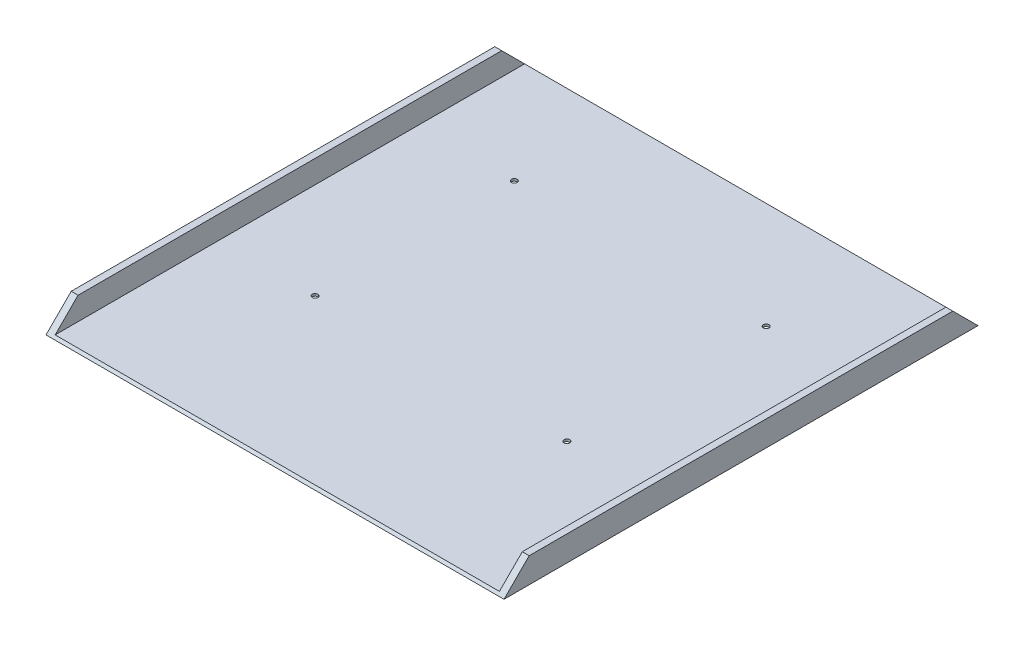
ISO-10303-21;
HEADER;
FILE_DESCRIPTION(('STEP AP214'),'2;1');
FILE_NAME('part.step','',(''),(''),'','','');
FILE_SCHEMA(('AUTOMOTIVE_DESIGN { 1 0 10303 214 1 1 1 1 }'));
ENDSEC;
DATA;
#1=APPLICATION_CONTEXT('core data for automotive mechanical design processes');
#2=APPLICATION_PROTOCOL_DEFINITION('international standard','automotive_design',2000,#1);
#3=PRODUCT_CONTEXT('',#1,'mechanical');
#4=PRODUCT('Part','Part','',(#3));
#5=PRODUCT_RELATED_PRODUCT_CATEGORY('part','',(#4));
#6=PRODUCT_DEFINITION_FORMATION('','',#4);
#7=PRODUCT_DEFINITION_CONTEXT('part definition',#1,'design');
#8=PRODUCT_DEFINITION('design','',#6,#7);
#9=PRODUCT_DEFINITION_SHAPE('','',#8);
#10=(LENGTH_UNIT() NAMED_UNIT(*) SI_UNIT(.MILLI.,.METRE.));
#11=(NAMED_UNIT(*) PLANE_ANGLE_UNIT() SI_UNIT($,.RADIAN.));
#12=(NAMED_UNIT(*) SI_UNIT($,.STERADIAN.) SOLID_ANGLE_UNIT());
#13=UNCERTAINTY_MEASURE_WITH_UNIT(LENGTH_MEASURE(1.E-05),#10,'distance_accuracy_value','');
#14=(GEOMETRIC_REPRESENTATION_CONTEXT(3) GLOBAL_UNCERTAINTY_ASSIGNED_CONTEXT((#13)) GLOBAL_UNIT_ASSIGNED_CONTEXT((#10,
#11,#12)) REPRESENTATION_CONTEXT('',''));
#15=CARTESIAN_POINT('',(0.,0.,0.));
#16=DIRECTION('',(0.,0.,1.));
#17=DIRECTION('',(1.,0.,0.));
#18=AXIS2_PLACEMENT_3D('',#15,#16,#17);
#19=CARTESIAN_POINT('',(0.,1.,0.));
#20=DIRECTION('',(0.,1.,0.));
#21=DIRECTION('',(0.,0.,1.));
#22=AXIS2_PLACEMENT_3D('',#19,#20,#21);
#23=PLANE('',#22);
#24=DIRECTION('',(0.,0.,-1.));
#25=VECTOR('',#24,1.);
#26=CARTESIAN_POINT('',(3.,1.,0.));
#27=LINE('',#26,#25);
#28=CARTESIAN_POINT('',(3.00000000000003,1.,215.));
#29=VERTEX_POINT('',#28);
#30=CARTESIAN_POINT('',(3.,1.,10.0000000000002));
#31=VERTEX_POINT('',#30);
#32=EDGE_CURVE('E141',#29,#31,#27,.T.);
#33=ORIENTED_EDGE('',*,*,#32,.F.);
#34=DIRECTION('',(1.,0.,0.));
#35=VECTOR('',#34,1.);
#36=CARTESIAN_POINT('',(0.,1.,215.));
#37=LINE('',#36,#35);
#38=CARTESIAN_POINT('',(197.,1.,215.));
#39=VERTEX_POINT('',#38);
#40=EDGE_CURVE('E221',#29,#39,#37,.T.);
#41=ORIENTED_EDGE('',*,*,#40,.T.);
#42=DIRECTION('',(0.,0.,1.));
#43=VECTOR('',#42,1.);
#44=CARTESIAN_POINT('',(197.,1.,0.));
#45=LINE('',#44,#43);
#46=CARTESIAN_POINT('',(197.,1.,10.0000000000002));
#47=VERTEX_POINT('',#46);
#48=EDGE_CURVE('E147',#47,#39,#45,.T.);
#49=ORIENTED_EDGE('',*,*,#48,.F.);
#50=DIRECTION('',(-1.,0.,0.));
#51=VECTOR('',#50,1.);
#52=CARTESIAN_POINT('',(0.,1.,10.0000000000002));
#53=LINE('',#52,#51);
#54=EDGE_CURVE('E208',#47,#31,#53,.T.);
#55=ORIENTED_EDGE('',*,*,#54,.T.);
#56=EDGE_LOOP('',(#33,#41,#49,#55));
#57=FACE_BOUND('',#56,.T.);
#58=CARTESIAN_POINT('',(45.,1.,143.5));
#59=DIRECTION('',(0.,1.,0.));
#60=DIRECTION('',(0.,0.,1.));
#61=AXIS2_PLACEMENT_3D('',#58,#59,#60);
#62=CIRCLE('',#61,1.25);
#63=CARTESIAN_POINT('',(45.,1.,144.75));
#64=VERTEX_POINT('',#63);
#65=EDGE_CURVE('E168',#64,#64,#62,.T.);
#66=ORIENTED_EDGE('',*,*,#65,.F.);
#67=EDGE_LOOP('',(#66));
#68=FACE_BOUND('',#67,.T.);
#69=CARTESIAN_POINT('',(45.,1.,56.5));
#70=DIRECTION('',(0.,1.,0.));
#71=DIRECTION('',(0.,0.,1.));
#72=AXIS2_PLACEMENT_3D('',#69,#70,#71);
#73=CIRCLE('',#72,1.25);
#74=CARTESIAN_POINT('',(45.,1.,57.75));
#75=VERTEX_POINT('',#74);
#76=EDGE_CURVE('E184',#75,#75,#73,.T.);
#77=ORIENTED_EDGE('',*,*,#76,.F.);
#78=EDGE_LOOP('',(#77));
#79=FACE_BOUND('',#78,.T.);
#80=CARTESIAN_POINT('',(155.,1.,56.5));
#81=DIRECTION('',(0.,1.,0.));
#82=DIRECTION('',(0.,0.,-1.));
#83=AXIS2_PLACEMENT_3D('',#80,#81,#82);
#84=CIRCLE('',#83,1.25000000000001);
#85=CARTESIAN_POINT('',(155.,1.,55.25));
#86=VERTEX_POINT('',#85);
#87=EDGE_CURVE('E176',#86,#86,#84,.T.);
#88=ORIENTED_EDGE('',*,*,#87,.F.);
#89=EDGE_LOOP('',(#88));
#90=FACE_BOUND('',#89,.T.);
#91=CARTESIAN_POINT('',(155.,1.,143.5));
#92=DIRECTION('',(0.,1.,0.));
#93=DIRECTION('',(0.,0.,-1.));
#94=AXIS2_PLACEMENT_3D('',#91,#92,#93);
#95=CIRCLE('',#94,1.25000000000001);
#96=CARTESIAN_POINT('',(155.,1.,142.25));
#97=VERTEX_POINT('',#96);
#98=EDGE_CURVE('E160',#97,#97,#95,.T.);
#99=ORIENTED_EDGE('',*,*,#98,.F.);
#100=EDGE_LOOP('',(#99));
#101=FACE_BOUND('',#100,.T.);
#102=ADVANCED_FACE('F47',(#57,#68,#79,#90,#101),#23,.T.);
#103=CARTESIAN_POINT('',(0.,0.,0.));
#104=DIRECTION('',(0.,1.,0.));
#105=DIRECTION('',(0.,0.,1.));
#106=AXIS2_PLACEMENT_3D('',#103,#104,#105);
#107=PLANE('',#106);
#108=DIRECTION('',(0.,0.,-1.));
#109=VECTOR('',#108,1.);
#110=CARTESIAN_POINT('',(200.,0.,0.));
#111=LINE('',#110,#109);
#112=CARTESIAN_POINT('',(200.,0.,216.));
#113=VERTEX_POINT('',#112);
#114=CARTESIAN_POINT('',(200.,0.,9.00000000000024));
#115=VERTEX_POINT('',#114);
#116=EDGE_CURVE('E136',#113,#115,#111,.T.);
#117=ORIENTED_EDGE('',*,*,#116,.F.);
#118=DIRECTION('',(-1.,0.,0.));
#119=VECTOR('',#118,1.);
#120=CARTESIAN_POINT('',(0.,0.,216.));
#121=LINE('',#120,#119);
#122=CARTESIAN_POINT('',(0.,0.,216.));
#123=VERTEX_POINT('',#122);
#124=EDGE_CURVE('E57',#113,#123,#121,.T.);
#125=ORIENTED_EDGE('',*,*,#124,.T.);
#126=DIRECTION('',(0.,0.,1.));
#127=VECTOR('',#126,1.);
#128=CARTESIAN_POINT('',(0.,0.,0.));
#129=LINE('',#128,#127);
#130=CARTESIAN_POINT('',(0.,0.,9.00000000000024));
#131=VERTEX_POINT('',#130);
#132=EDGE_CURVE('E188',#131,#123,#129,.T.);
#133=ORIENTED_EDGE('',*,*,#132,.F.);
#134=DIRECTION('',(1.,0.,0.));
#135=VECTOR('',#134,1.);
#136=CARTESIAN_POINT('',(0.,0.,9.00000000000024));
#137=LINE('',#136,#135);
#138=EDGE_CURVE('E121',#131,#115,#137,.T.);
#139=ORIENTED_EDGE('',*,*,#138,.T.);
#140=EDGE_LOOP('',(#117,#125,#133,#139));
#141=FACE_BOUND('',#140,.T.);
#142=CARTESIAN_POINT('',(45.,0.,56.5));
#143=DIRECTION('',(0.,1.,0.));
#144=DIRECTION('',(0.,0.,1.));
#145=AXIS2_PLACEMENT_3D('',#142,#143,#144);
#146=CIRCLE('',#145,1.25);
#147=CARTESIAN_POINT('',(45.,0.,57.75));
#148=VERTEX_POINT('',#147);
#149=EDGE_CURVE('E180',#148,#148,#146,.T.);
#150=ORIENTED_EDGE('',*,*,#149,.T.);
#151=EDGE_LOOP('',(#150));
#152=FACE_BOUND('',#151,.T.);
#153=CARTESIAN_POINT('',(155.,0.,56.5));
#154=DIRECTION('',(0.,1.,0.));
#155=DIRECTION('',(0.,0.,-1.));
#156=AXIS2_PLACEMENT_3D('',#153,#154,#155);
#157=CIRCLE('',#156,1.25000000000001);
#158=CARTESIAN_POINT('',(155.,0.,55.25));
#159=VERTEX_POINT('',#158);
#160=EDGE_CURVE('E172',#159,#159,#157,.T.);
#161=ORIENTED_EDGE('',*,*,#160,.T.);
#162=EDGE_LOOP('',(#161));
#163=FACE_BOUND('',#162,.T.);
#164=CARTESIAN_POINT('',(45.,0.,143.5));
#165=DIRECTION('',(0.,1.,0.));
#166=DIRECTION('',(0.,0.,1.));
#167=AXIS2_PLACEMENT_3D('',#164,#165,#166);
#168=CIRCLE('',#167,1.25);
#169=CARTESIAN_POINT('',(45.,0.,144.75));
#170=VERTEX_POINT('',#169);
#171=EDGE_CURVE('E164',#170,#170,#168,.T.);
#172=ORIENTED_EDGE('',*,*,#171,.T.);
#173=EDGE_LOOP('',(#172));
#174=FACE_BOUND('',#173,.T.);
#175=CARTESIAN_POINT('',(155.,0.,143.5));
#176=DIRECTION('',(0.,1.,0.));
#177=DIRECTION('',(0.,0.,-1.));
#178=AXIS2_PLACEMENT_3D('',#175,#176,#177);
#179=CIRCLE('',#178,1.25000000000001);
#180=CARTESIAN_POINT('',(155.,0.,142.25));
#181=VERTEX_POINT('',#180);
#182=EDGE_CURVE('E145',#181,#181,#179,.T.);
#183=ORIENTED_EDGE('',*,*,#182,.T.);
#184=EDGE_LOOP('',(#183));
#185=FACE_BOUND('',#184,.T.);
#186=ADVANCED_FACE('F265',(#141,#152,#163,#174,#185),#107,.F.);
#187=CARTESIAN_POINT('',(0.,1.,0.));
#188=DIRECTION('',(1.,0.,0.));
#189=DIRECTION('',(0.,0.,-1.));
#190=AXIS2_PLACEMENT_3D('',#187,#188,#189);
#191=PLANE('',#190);
#192=ORIENTED_EDGE('',*,*,#132,.T.);
#193=DIRECTION('',(0.,0.707106781186544,-0.707106781186551));
#194=VECTOR('',#193,1.);
#195=CARTESIAN_POINT('',(0.,11.,205.));
#196=LINE('',#195,#194);
#197=CARTESIAN_POINT('',(0.,11.,205.));
#198=VERTEX_POINT('',#197);
#199=EDGE_CURVE('E11',#123,#198,#196,.T.);
#200=ORIENTED_EDGE('',*,*,#199,.T.);
#201=DIRECTION('',(0.,0.,1.));
#202=VECTOR('',#201,1.);
#203=CARTESIAN_POINT('',(0.,11.,0.));
#204=LINE('',#203,#202);
#205=CARTESIAN_POINT('',(0.,11.,20.0000000000004));
#206=VERTEX_POINT('',#205);
#207=EDGE_CURVE('E130',#206,#198,#204,.T.);
#208=ORIENTED_EDGE('',*,*,#207,.F.);
#209=DIRECTION('',(0.,-0.707106781186544,-0.707106781186551));
#210=VECTOR('',#209,1.);
#211=CARTESIAN_POINT('',(0.,11.,20.0000000000004));
#212=LINE('',#211,#210);
#213=EDGE_CURVE('E114',#206,#131,#212,.T.);
#214=ORIENTED_EDGE('',*,*,#213,.T.);
#215=EDGE_LOOP('',(#192,#200,#208,#214));
#216=FACE_BOUND('',#215,.T.);
#217=ADVANCED_FACE('F138',(#216),#191,.F.);
#218=CARTESIAN_POINT('',(200.,1.,0.));
#219=DIRECTION('',(-1.,0.,0.));
#220=DIRECTION('',(0.,0.,1.));
#221=AXIS2_PLACEMENT_3D('',#218,#219,#220);
#222=PLANE('',#221);
#223=DIRECTION('',(0.,0.,-1.));
#224=VECTOR('',#223,1.);
#225=CARTESIAN_POINT('',(200.,11.,0.));
#226=LINE('',#225,#224);
#227=CARTESIAN_POINT('',(200.,11.,205.));
#228=VERTEX_POINT('',#227);
#229=CARTESIAN_POINT('',(200.,11.,20.0000000000004));
#230=VERTEX_POINT('',#229);
#231=EDGE_CURVE('E153',#228,#230,#226,.T.);
#232=ORIENTED_EDGE('',*,*,#231,.F.);
#233=DIRECTION('',(0.,-0.707106781186544,0.707106781186551));
#234=VECTOR('',#233,1.);
#235=CARTESIAN_POINT('',(200.,11.,205.));
#236=LINE('',#235,#234);
#237=EDGE_CURVE('E71',#228,#113,#236,.T.);
#238=ORIENTED_EDGE('',*,*,#237,.T.);
#239=ORIENTED_EDGE('',*,*,#116,.T.);
#240=DIRECTION('',(0.,0.707106781186544,0.707106781186551));
#241=VECTOR('',#240,1.);
#242=CARTESIAN_POINT('',(200.,11.,20.0000000000003));
#243=LINE('',#242,#241);
#244=EDGE_CURVE('E198',#115,#230,#243,.T.);
#245=ORIENTED_EDGE('',*,*,#244,.T.);
#246=EDGE_LOOP('',(#232,#238,#239,#245));
#247=FACE_BOUND('',#246,.T.);
#248=ADVANCED_FACE('F238',(#247),#222,.F.);
#249=CARTESIAN_POINT('',(45.,1.,56.5));
#250=DIRECTION('',(0.,-1.,0.));
#251=DIRECTION('',(0.,0.,-1.));
#252=AXIS2_PLACEMENT_3D('',#249,#250,#251);
#253=CYLINDRICAL_SURFACE('',#252,1.25);
#254=ORIENTED_EDGE('',*,*,#76,.T.);
#255=EDGE_LOOP('',(#254));
#256=FACE_BOUND('',#255,.T.);
#257=ORIENTED_EDGE('',*,*,#149,.F.);
#258=EDGE_LOOP('',(#257));
#259=FACE_BOUND('',#258,.T.);
#260=ADVANCED_FACE('F273',(#256,#259),#253,.F.);
#261=CARTESIAN_POINT('',(155.,1.,56.5));
#262=DIRECTION('',(0.,-1.,0.));
#263=DIRECTION('',(0.,0.,-1.));
#264=AXIS2_PLACEMENT_3D('',#261,#262,#263);
#265=CYLINDRICAL_SURFACE('',#264,1.25000000000001);
#266=ORIENTED_EDGE('',*,*,#87,.T.);
#267=EDGE_LOOP('',(#266));
#268=FACE_BOUND('',#267,.T.);
#269=ORIENTED_EDGE('',*,*,#160,.F.);
#270=EDGE_LOOP('',(#269));
#271=FACE_BOUND('',#270,.T.);
#272=ADVANCED_FACE('F334',(#268,#271),#265,.F.);
#273=CARTESIAN_POINT('',(45.,1.,143.5));
#274=DIRECTION('',(0.,-1.,0.));
#275=DIRECTION('',(0.,0.,-1.));
#276=AXIS2_PLACEMENT_3D('',#273,#274,#275);
#277=CYLINDRICAL_SURFACE('',#276,1.25);
#278=ORIENTED_EDGE('',*,*,#65,.T.);
#279=EDGE_LOOP('',(#278));
#280=FACE_BOUND('',#279,.T.);
#281=ORIENTED_EDGE('',*,*,#171,.F.);
#282=EDGE_LOOP('',(#281));
#283=FACE_BOUND('',#282,.T.);
#284=ADVANCED_FACE('F260',(#280,#283),#277,.F.);
#285=CARTESIAN_POINT('',(155.,1.,143.5));
#286=DIRECTION('',(0.,-1.,0.));
#287=DIRECTION('',(0.,0.,-1.));
#288=AXIS2_PLACEMENT_3D('',#285,#286,#287);
#289=CYLINDRICAL_SURFACE('',#288,1.25000000000001);
#290=ORIENTED_EDGE('',*,*,#98,.T.);
#291=EDGE_LOOP('',(#290));
#292=FACE_BOUND('',#291,.T.);
#293=ORIENTED_EDGE('',*,*,#182,.F.);
#294=EDGE_LOOP('',(#293));
#295=FACE_BOUND('',#294,.T.);
#296=ADVANCED_FACE('F252',(#292,#295),#289,.F.);
#297=CARTESIAN_POINT('',(197.,11.,0.));
#298=DIRECTION('',(1.,0.,0.));
#299=DIRECTION('',(0.,0.,-1.));
#300=AXIS2_PLACEMENT_3D('',#297,#298,#299);
#301=PLANE('',#300);
#302=ORIENTED_EDGE('',*,*,#48,.T.);
#303=DIRECTION('',(0.,0.707106781186544,-0.707106781186551));
#304=VECTOR('',#303,1.);
#305=CARTESIAN_POINT('',(197.,11.,205.));
#306=LINE('',#305,#304);
#307=CARTESIAN_POINT('',(197.,11.,205.));
#308=VERTEX_POINT('',#307);
#309=EDGE_CURVE('E224',#39,#308,#306,.T.);
#310=ORIENTED_EDGE('',*,*,#309,.T.);
#311=DIRECTION('',(0.,0.,1.));
#312=VECTOR('',#311,1.);
#313=CARTESIAN_POINT('',(197.,11.,0.));
#314=LINE('',#313,#312);
#315=CARTESIAN_POINT('',(197.,11.,20.0000000000004));
#316=VERTEX_POINT('',#315);
#317=EDGE_CURVE('E154',#316,#308,#314,.T.);
#318=ORIENTED_EDGE('',*,*,#317,.F.);
#319=DIRECTION('',(0.,-0.707106781186544,-0.707106781186551));
#320=VECTOR('',#319,1.);
#321=CARTESIAN_POINT('',(197.,11.,20.0000000000003));
#322=LINE('',#321,#320);
#323=EDGE_CURVE('E205',#316,#47,#322,.T.);
#324=ORIENTED_EDGE('',*,*,#323,.T.);
#325=EDGE_LOOP('',(#302,#310,#318,#324));
#326=FACE_BOUND('',#325,.T.);
#327=ADVANCED_FACE('F250',(#326),#301,.F.);
#328=CARTESIAN_POINT('',(0.,11.,0.));
#329=DIRECTION('',(0.,-1.,0.));
#330=DIRECTION('',(0.,0.,-1.));
#331=AXIS2_PLACEMENT_3D('',#328,#329,#330);
#332=PLANE('',#331);
#333=ORIENTED_EDGE('',*,*,#317,.T.);
#334=DIRECTION('',(1.,0.,0.));
#335=VECTOR('',#334,1.);
#336=CARTESIAN_POINT('',(0.,11.,205.));
#337=LINE('',#336,#335);
#338=EDGE_CURVE('E227',#308,#228,#337,.T.);
#339=ORIENTED_EDGE('',*,*,#338,.T.);
#340=ORIENTED_EDGE('',*,*,#231,.T.);
#341=DIRECTION('',(-1.,0.,0.));
#342=VECTOR('',#341,1.);
#343=CARTESIAN_POINT('',(0.,11.,20.0000000000004));
#344=LINE('',#343,#342);
#345=EDGE_CURVE('E202',#230,#316,#344,.T.);
#346=ORIENTED_EDGE('',*,*,#345,.T.);
#347=EDGE_LOOP('',(#333,#339,#340,#346));
#348=FACE_BOUND('',#347,.T.);
#349=ADVANCED_FACE('F234',(#348),#332,.F.);
#350=CARTESIAN_POINT('',(3.,11.,0.));
#351=DIRECTION('',(-1.,0.,0.));
#352=DIRECTION('',(0.,0.,1.));
#353=AXIS2_PLACEMENT_3D('',#350,#351,#352);
#354=PLANE('',#353);
#355=DIRECTION('',(0.,0.,-1.));
#356=VECTOR('',#355,1.);
#357=CARTESIAN_POINT('',(3.,11.,0.));
#358=LINE('',#357,#356);
#359=CARTESIAN_POINT('',(3.00000000000002,11.,205.));
#360=VERTEX_POINT('',#359);
#361=CARTESIAN_POINT('',(3.,11.,20.0000000000004));
#362=VERTEX_POINT('',#361);
#363=EDGE_CURVE('E133',#360,#362,#358,.T.);
#364=ORIENTED_EDGE('',*,*,#363,.F.);
#365=DIRECTION('',(0.,-0.707106781186544,0.707106781186551));
#366=VECTOR('',#365,1.);
#367=CARTESIAN_POINT('',(3.00000000000002,11.,205.));
#368=LINE('',#367,#366);
#369=EDGE_CURVE('E218',#360,#29,#368,.T.);
#370=ORIENTED_EDGE('',*,*,#369,.T.);
#371=ORIENTED_EDGE('',*,*,#32,.T.);
#372=DIRECTION('',(0.,0.707106781186544,0.707106781186551));
#373=VECTOR('',#372,1.);
#374=CARTESIAN_POINT('',(3.,11.,20.0000000000004));
#375=LINE('',#374,#373);
#376=EDGE_CURVE('E212',#31,#362,#375,.T.);
#377=ORIENTED_EDGE('',*,*,#376,.T.);
#378=EDGE_LOOP('',(#364,#370,#371,#377));
#379=FACE_BOUND('',#378,.T.);
#380=ADVANCED_FACE('F242',(#379),#354,.F.);
#381=CARTESIAN_POINT('',(0.,11.,0.));
#382=DIRECTION('',(0.,1.,0.));
#383=DIRECTION('',(0.,0.,1.));
#384=AXIS2_PLACEMENT_3D('',#381,#382,#383);
#385=PLANE('',#384);
#386=ORIENTED_EDGE('',*,*,#207,.T.);
#387=DIRECTION('',(1.,0.,0.));
#388=VECTOR('',#387,1.);
#389=CARTESIAN_POINT('',(3.00000000000003,11.,205.));
#390=LINE('',#389,#388);
#391=EDGE_CURVE('E215',#198,#360,#390,.T.);
#392=ORIENTED_EDGE('',*,*,#391,.T.);
#393=ORIENTED_EDGE('',*,*,#363,.T.);
#394=DIRECTION('',(-1.,0.,0.));
#395=VECTOR('',#394,1.);
#396=CARTESIAN_POINT('',(0.,11.,20.0000000000004));
#397=LINE('',#396,#395);
#398=EDGE_CURVE('E119',#362,#206,#397,.T.);
#399=ORIENTED_EDGE('',*,*,#398,.T.);
#400=EDGE_LOOP('',(#386,#392,#393,#399));
#401=FACE_BOUND('',#400,.T.);
#402=ADVANCED_FACE('F128',(#401),#385,.T.);
#403=CARTESIAN_POINT('',(0.,11.,20.0000000000004));
#404=DIRECTION('',(0.,0.707106781186551,-0.707106781186544));
#405=DIRECTION('',(1.,0.,0.));
#406=AXIS2_PLACEMENT_3D('',#403,#404,#405);
#407=PLANE('',#406);
#408=ORIENTED_EDGE('',*,*,#244,.F.);
#409=ORIENTED_EDGE('',*,*,#138,.F.);
#410=ORIENTED_EDGE('',*,*,#213,.F.);
#411=ORIENTED_EDGE('',*,*,#398,.F.);
#412=ORIENTED_EDGE('',*,*,#376,.F.);
#413=ORIENTED_EDGE('',*,*,#54,.F.);
#414=ORIENTED_EDGE('',*,*,#323,.F.);
#415=ORIENTED_EDGE('',*,*,#345,.F.);
#416=EDGE_LOOP('',(#408,#409,#410,#411,#412,#413,#414,#415));
#417=FACE_BOUND('',#416,.T.);
#418=ADVANCED_FACE('F117',(#417),#407,.T.);
#419=CARTESIAN_POINT('',(0.,11.,205.));
#420=DIRECTION('',(0.,0.707106781186551,0.707106781186544));
#421=DIRECTION('',(-1.,0.,0.));
#422=AXIS2_PLACEMENT_3D('',#419,#420,#421);
#423=PLANE('',#422);
#424=ORIENTED_EDGE('',*,*,#199,.F.);
#425=ORIENTED_EDGE('',*,*,#124,.F.);
#426=ORIENTED_EDGE('',*,*,#237,.F.);
#427=ORIENTED_EDGE('',*,*,#338,.F.);
#428=ORIENTED_EDGE('',*,*,#309,.F.);
#429=ORIENTED_EDGE('',*,*,#40,.F.);
#430=ORIENTED_EDGE('',*,*,#369,.F.);
#431=ORIENTED_EDGE('',*,*,#391,.F.);
#432=EDGE_LOOP('',(#424,#425,#426,#427,#428,#429,#430,#431));
#433=FACE_BOUND('',#432,.T.);
#434=ADVANCED_FACE('F50',(#433),#423,.T.);
#435=CLOSED_SHELL('',(#102,#186,#217,#248,#260,#272,#284,#296,#327,#349,#380,#402,#418,#434));
#436=MANIFOLD_SOLID_BREP('B2',#435);
#437=ADVANCED_BREP_SHAPE_REPRESENTATION('',(#18,#436),#14);
#438=SHAPE_DEFINITION_REPRESENTATION(#9,#437);
ENDSEC;
END-ISO-10303-21;
